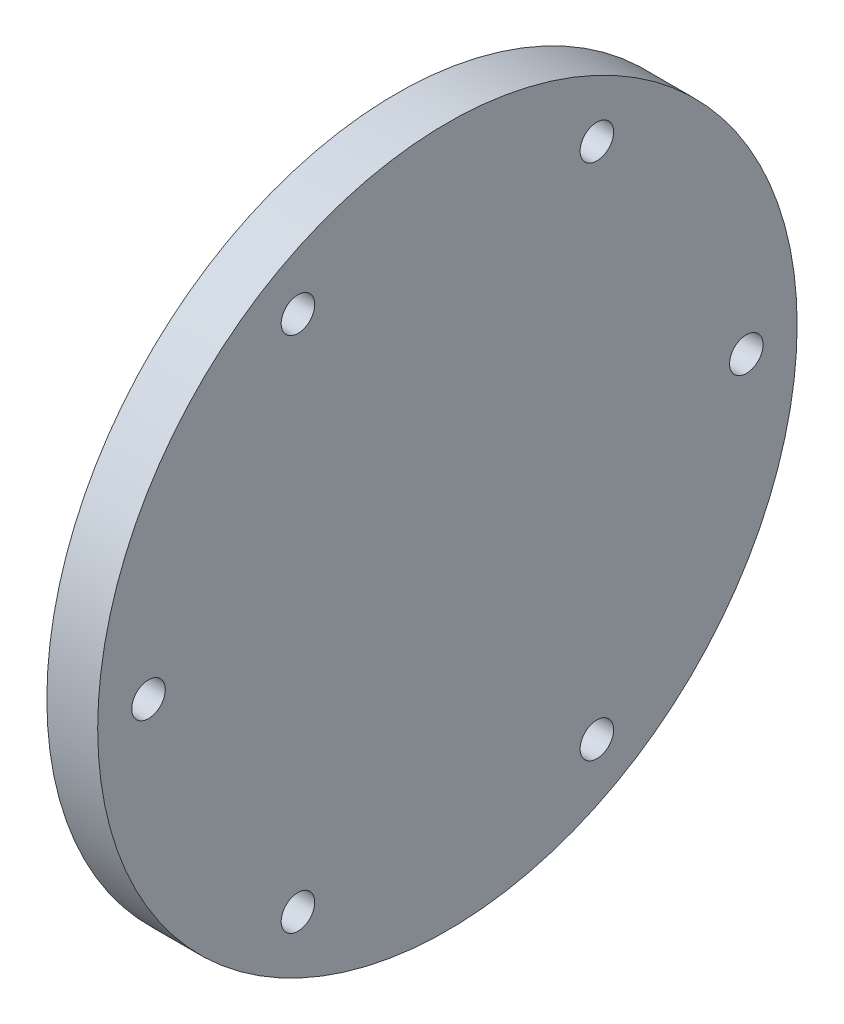
ISO-10303-21;
HEADER;
FILE_DESCRIPTION(('STEP AP214'),'2;1');
FILE_NAME('part.step','',(''),(''),'','','');
FILE_SCHEMA(('AUTOMOTIVE_DESIGN { 1 0 10303 214 1 1 1 1 }'));
ENDSEC;
DATA;
#1=APPLICATION_CONTEXT('core data for automotive mechanical design processes');
#2=APPLICATION_PROTOCOL_DEFINITION('international standard','automotive_design',2000,#1);
#3=PRODUCT_CONTEXT('',#1,'mechanical');
#4=PRODUCT('Part','Part','',(#3));
#5=PRODUCT_RELATED_PRODUCT_CATEGORY('part','',(#4));
#6=PRODUCT_DEFINITION_FORMATION('','',#4);
#7=PRODUCT_DEFINITION_CONTEXT('part definition',#1,'design');
#8=PRODUCT_DEFINITION('design','',#6,#7);
#9=PRODUCT_DEFINITION_SHAPE('','',#8);
#10=(LENGTH_UNIT() NAMED_UNIT(*) SI_UNIT(.MILLI.,.METRE.));
#11=(NAMED_UNIT(*) PLANE_ANGLE_UNIT() SI_UNIT($,.RADIAN.));
#12=(NAMED_UNIT(*) SI_UNIT($,.STERADIAN.) SOLID_ANGLE_UNIT());
#13=UNCERTAINTY_MEASURE_WITH_UNIT(LENGTH_MEASURE(1.E-05),#10,'distance_accuracy_value','');
#14=(GEOMETRIC_REPRESENTATION_CONTEXT(3) GLOBAL_UNCERTAINTY_ASSIGNED_CONTEXT((#13)) GLOBAL_UNIT_ASSIGNED_CONTEXT((#10,
#11,#12)) REPRESENTATION_CONTEXT('',''));
#15=CARTESIAN_POINT('',(0.,0.,0.));
#16=DIRECTION('',(0.,0.,1.));
#17=DIRECTION('',(1.,0.,0.));
#18=AXIS2_PLACEMENT_3D('',#15,#16,#17);
#19=CARTESIAN_POINT('',(163.7,34.4,0.));
#20=DIRECTION('',(1.,0.,0.));
#21=DIRECTION('',(0.,0.,-1.));
#22=AXIS2_PLACEMENT_3D('',#19,#20,#21);
#23=PLANE('',#22);
#24=CARTESIAN_POINT('',(163.7,0.,29.4));
#25=DIRECTION('',(1.,0.,0.));
#26=DIRECTION('',(0.,0.,-1.));
#27=AXIS2_PLACEMENT_3D('',#24,#25,#26);
#28=CIRCLE('',#27,1.65);
#29=CARTESIAN_POINT('',(163.7,0.,27.75));
#30=VERTEX_POINT('',#29);
#31=EDGE_CURVE('E49',#30,#30,#28,.F.);
#32=ORIENTED_EDGE('',*,*,#31,.F.);
#33=EDGE_LOOP('',(#32));
#34=FACE_BOUND('',#33,.T.);
#35=CARTESIAN_POINT('',(163.7,-25.4611468712625,14.7));
#36=DIRECTION('',(1.,0.,0.));
#37=DIRECTION('',(0.,0.,-1.));
#38=AXIS2_PLACEMENT_3D('',#35,#36,#37);
#39=CIRCLE('',#38,1.65);
#40=CARTESIAN_POINT('',(163.7,-25.4611468712625,13.05));
#41=VERTEX_POINT('',#40);
#42=EDGE_CURVE('E54',#41,#41,#39,.F.);
#43=ORIENTED_EDGE('',*,*,#42,.F.);
#44=EDGE_LOOP('',(#43));
#45=FACE_BOUND('',#44,.T.);
#46=CARTESIAN_POINT('',(163.7,-25.4611468712625,-14.7));
#47=DIRECTION('',(1.,0.,0.));
#48=DIRECTION('',(0.,0.,-1.));
#49=AXIS2_PLACEMENT_3D('',#46,#47,#48);
#50=CIRCLE('',#49,1.65);
#51=CARTESIAN_POINT('',(163.7,-25.4611468712625,-16.35));
#52=VERTEX_POINT('',#51);
#53=EDGE_CURVE('E60',#52,#52,#50,.F.);
#54=ORIENTED_EDGE('',*,*,#53,.F.);
#55=EDGE_LOOP('',(#54));
#56=FACE_BOUND('',#55,.T.);
#57=CARTESIAN_POINT('',(163.7,25.4611468712625,-14.7));
#58=DIRECTION('',(1.,0.,0.));
#59=DIRECTION('',(0.,0.,-1.));
#60=AXIS2_PLACEMENT_3D('',#57,#58,#59);
#61=CIRCLE('',#60,1.65);
#62=CARTESIAN_POINT('',(163.7,25.4611468712625,-16.35));
#63=VERTEX_POINT('',#62);
#64=EDGE_CURVE('E64',#63,#63,#61,.F.);
#65=ORIENTED_EDGE('',*,*,#64,.F.);
#66=EDGE_LOOP('',(#65));
#67=FACE_BOUND('',#66,.T.);
#68=CARTESIAN_POINT('',(163.7,0.,-29.4));
#69=DIRECTION('',(1.,0.,0.));
#70=DIRECTION('',(0.,0.,-1.));
#71=AXIS2_PLACEMENT_3D('',#68,#69,#70);
#72=CIRCLE('',#71,1.65);
#73=CARTESIAN_POINT('',(163.7,0.,-31.05));
#74=VERTEX_POINT('',#73);
#75=EDGE_CURVE('E68',#74,#74,#72,.F.);
#76=ORIENTED_EDGE('',*,*,#75,.F.);
#77=EDGE_LOOP('',(#76));
#78=FACE_BOUND('',#77,.T.);
#79=CARTESIAN_POINT('',(163.7,25.4611468712625,14.7));
#80=DIRECTION('',(1.,0.,0.));
#81=DIRECTION('',(0.,0.,-1.));
#82=AXIS2_PLACEMENT_3D('',#79,#80,#81);
#83=CIRCLE('',#82,1.65);
#84=CARTESIAN_POINT('',(163.7,25.4611468712625,13.05));
#85=VERTEX_POINT('',#84);
#86=EDGE_CURVE('E72',#85,#85,#83,.F.);
#87=ORIENTED_EDGE('',*,*,#86,.F.);
#88=EDGE_LOOP('',(#87));
#89=FACE_BOUND('',#88,.T.);
#90=CARTESIAN_POINT('',(163.7,0.,0.));
#91=DIRECTION('',(-1.,0.,0.));
#92=DIRECTION('',(0.,0.,1.));
#93=AXIS2_PLACEMENT_3D('',#90,#91,#92);
#94=CIRCLE('',#93,34.4);
#95=CARTESIAN_POINT('',(163.7,0.,34.4));
#96=VERTEX_POINT('',#95);
#97=EDGE_CURVE('E44',#96,#96,#94,.T.);
#98=ORIENTED_EDGE('',*,*,#97,.T.);
#99=EDGE_LOOP('',(#98));
#100=FACE_BOUND('',#99,.T.);
#101=ADVANCED_FACE('F37',(#34,#45,#56,#67,#78,#89,#100),#23,.F.);
#102=CARTESIAN_POINT('',(168.7,0.,0.));
#103=DIRECTION('',(-1.,0.,0.));
#104=DIRECTION('',(0.,0.,1.));
#105=AXIS2_PLACEMENT_3D('',#102,#103,#104);
#106=PLANE('',#105);
#107=CARTESIAN_POINT('',(168.7,0.,29.4));
#108=DIRECTION('',(1.,0.,0.));
#109=DIRECTION('',(0.,0.,-1.));
#110=AXIS2_PLACEMENT_3D('',#107,#108,#109);
#111=CIRCLE('',#110,1.65);
#112=CARTESIAN_POINT('',(168.7,0.,27.75));
#113=VERTEX_POINT('',#112);
#114=EDGE_CURVE('E76',#113,#113,#111,.T.);
#115=ORIENTED_EDGE('',*,*,#114,.F.);
#116=EDGE_LOOP('',(#115));
#117=FACE_BOUND('',#116,.T.);
#118=CARTESIAN_POINT('',(168.7,-25.4611468712625,14.7));
#119=DIRECTION('',(1.,0.,0.));
#120=DIRECTION('',(0.,0.,-1.));
#121=AXIS2_PLACEMENT_3D('',#118,#119,#120);
#122=CIRCLE('',#121,1.65);
#123=CARTESIAN_POINT('',(168.7,-25.4611468712625,13.05));
#124=VERTEX_POINT('',#123);
#125=EDGE_CURVE('E90',#124,#124,#122,.T.);
#126=ORIENTED_EDGE('',*,*,#125,.F.);
#127=EDGE_LOOP('',(#126));
#128=FACE_BOUND('',#127,.T.);
#129=CARTESIAN_POINT('',(168.7,-25.4611468712625,-14.7));
#130=DIRECTION('',(1.,0.,0.));
#131=DIRECTION('',(0.,0.,-1.));
#132=AXIS2_PLACEMENT_3D('',#129,#130,#131);
#133=CIRCLE('',#132,1.65);
#134=CARTESIAN_POINT('',(168.7,-25.4611468712625,-16.35));
#135=VERTEX_POINT('',#134);
#136=EDGE_CURVE('E81',#135,#135,#133,.T.);
#137=ORIENTED_EDGE('',*,*,#136,.F.);
#138=EDGE_LOOP('',(#137));
#139=FACE_BOUND('',#138,.T.);
#140=CARTESIAN_POINT('',(168.7,25.4611468712625,-14.7));
#141=DIRECTION('',(1.,0.,0.));
#142=DIRECTION('',(0.,0.,-1.));
#143=AXIS2_PLACEMENT_3D('',#140,#141,#142);
#144=CIRCLE('',#143,1.65);
#145=CARTESIAN_POINT('',(168.7,25.4611468712625,-16.35));
#146=VERTEX_POINT('',#145);
#147=EDGE_CURVE('E77',#146,#146,#144,.T.);
#148=ORIENTED_EDGE('',*,*,#147,.F.);
#149=EDGE_LOOP('',(#148));
#150=FACE_BOUND('',#149,.T.);
#151=CARTESIAN_POINT('',(168.7,0.,-29.4));
#152=DIRECTION('',(1.,0.,0.));
#153=DIRECTION('',(0.,0.,-1.));
#154=AXIS2_PLACEMENT_3D('',#151,#152,#153);
#155=CIRCLE('',#154,1.65);
#156=CARTESIAN_POINT('',(168.7,0.,-31.05));
#157=VERTEX_POINT('',#156);
#158=EDGE_CURVE('E82',#157,#157,#155,.T.);
#159=ORIENTED_EDGE('',*,*,#158,.F.);
#160=EDGE_LOOP('',(#159));
#161=FACE_BOUND('',#160,.T.);
#162=CARTESIAN_POINT('',(168.7,25.4611468712625,14.7));
#163=DIRECTION('',(1.,0.,0.));
#164=DIRECTION('',(0.,0.,-1.));
#165=AXIS2_PLACEMENT_3D('',#162,#163,#164);
#166=CIRCLE('',#165,1.65);
#167=CARTESIAN_POINT('',(168.7,25.4611468712625,13.05));
#168=VERTEX_POINT('',#167);
#169=EDGE_CURVE('E86',#168,#168,#166,.T.);
#170=ORIENTED_EDGE('',*,*,#169,.F.);
#171=EDGE_LOOP('',(#170));
#172=FACE_BOUND('',#171,.T.);
#173=CARTESIAN_POINT('',(168.7,0.,0.));
#174=DIRECTION('',(-1.,0.,0.));
#175=DIRECTION('',(0.,0.,1.));
#176=AXIS2_PLACEMENT_3D('',#173,#174,#175);
#177=CIRCLE('',#176,34.4);
#178=CARTESIAN_POINT('',(168.7,0.,34.4));
#179=VERTEX_POINT('',#178);
#180=EDGE_CURVE('E10',#179,#179,#177,.T.);
#181=ORIENTED_EDGE('',*,*,#180,.F.);
#182=EDGE_LOOP('',(#181));
#183=FACE_BOUND('',#182,.T.);
#184=ADVANCED_FACE('F104',(#117,#128,#139,#150,#161,#172,#183),#106,.F.);
#185=CARTESIAN_POINT('',(-110.,0.,0.));
#186=DIRECTION('',(-1.,0.,0.));
#187=DIRECTION('',(0.,0.,1.));
#188=AXIS2_PLACEMENT_3D('',#185,#186,#187);
#189=CYLINDRICAL_SURFACE('',#188,34.4);
#190=ORIENTED_EDGE('',*,*,#97,.F.);
#191=EDGE_LOOP('',(#190));
#192=FACE_BOUND('',#191,.T.);
#193=ORIENTED_EDGE('',*,*,#180,.T.);
#194=EDGE_LOOP('',(#193));
#195=FACE_BOUND('',#194,.T.);
#196=ADVANCED_FACE('F107',(#192,#195),#189,.T.);
#197=CARTESIAN_POINT('',(163.7,25.4611468712625,14.7));
#198=DIRECTION('',(-1.,0.,0.));
#199=DIRECTION('',(0.,0.,1.));
#200=AXIS2_PLACEMENT_3D('',#197,#198,#199);
#201=CYLINDRICAL_SURFACE('',#200,1.65);
#202=ORIENTED_EDGE('',*,*,#169,.T.);
#203=EDGE_LOOP('',(#202));
#204=FACE_BOUND('',#203,.T.);
#205=ORIENTED_EDGE('',*,*,#86,.T.);
#206=EDGE_LOOP('',(#205));
#207=FACE_BOUND('',#206,.T.);
#208=ADVANCED_FACE('F119',(#204,#207),#201,.F.);
#209=CARTESIAN_POINT('',(163.7,0.,-29.4));
#210=DIRECTION('',(-1.,0.,0.));
#211=DIRECTION('',(0.,0.,1.));
#212=AXIS2_PLACEMENT_3D('',#209,#210,#211);
#213=CYLINDRICAL_SURFACE('',#212,1.65);
#214=ORIENTED_EDGE('',*,*,#158,.T.);
#215=EDGE_LOOP('',(#214));
#216=FACE_BOUND('',#215,.T.);
#217=ORIENTED_EDGE('',*,*,#75,.T.);
#218=EDGE_LOOP('',(#217));
#219=FACE_BOUND('',#218,.T.);
#220=ADVANCED_FACE('F122',(#216,#219),#213,.F.);
#221=CARTESIAN_POINT('',(163.7,25.4611468712625,-14.7));
#222=DIRECTION('',(-1.,0.,0.));
#223=DIRECTION('',(0.,0.,1.));
#224=AXIS2_PLACEMENT_3D('',#221,#222,#223);
#225=CYLINDRICAL_SURFACE('',#224,1.65);
#226=ORIENTED_EDGE('',*,*,#147,.T.);
#227=EDGE_LOOP('',(#226));
#228=FACE_BOUND('',#227,.T.);
#229=ORIENTED_EDGE('',*,*,#64,.T.);
#230=EDGE_LOOP('',(#229));
#231=FACE_BOUND('',#230,.T.);
#232=ADVANCED_FACE('F141',(#228,#231),#225,.F.);
#233=CARTESIAN_POINT('',(163.7,-25.4611468712625,-14.7));
#234=DIRECTION('',(-1.,0.,0.));
#235=DIRECTION('',(0.,0.,1.));
#236=AXIS2_PLACEMENT_3D('',#233,#234,#235);
#237=CYLINDRICAL_SURFACE('',#236,1.65);
#238=ORIENTED_EDGE('',*,*,#136,.T.);
#239=EDGE_LOOP('',(#238));
#240=FACE_BOUND('',#239,.T.);
#241=ORIENTED_EDGE('',*,*,#53,.T.);
#242=EDGE_LOOP('',(#241));
#243=FACE_BOUND('',#242,.T.);
#244=ADVANCED_FACE('F147',(#240,#243),#237,.F.);
#245=CARTESIAN_POINT('',(163.7,-25.4611468712625,14.7));
#246=DIRECTION('',(-1.,0.,0.));
#247=DIRECTION('',(0.,0.,1.));
#248=AXIS2_PLACEMENT_3D('',#245,#246,#247);
#249=CYLINDRICAL_SURFACE('',#248,1.65);
#250=ORIENTED_EDGE('',*,*,#125,.T.);
#251=EDGE_LOOP('',(#250));
#252=FACE_BOUND('',#251,.T.);
#253=ORIENTED_EDGE('',*,*,#42,.T.);
#254=EDGE_LOOP('',(#253));
#255=FACE_BOUND('',#254,.T.);
#256=ADVANCED_FACE('F151',(#252,#255),#249,.F.);
#257=CARTESIAN_POINT('',(163.7,0.,29.4));
#258=DIRECTION('',(-1.,0.,0.));
#259=DIRECTION('',(0.,0.,1.));
#260=AXIS2_PLACEMENT_3D('',#257,#258,#259);
#261=CYLINDRICAL_SURFACE('',#260,1.65);
#262=ORIENTED_EDGE('',*,*,#114,.T.);
#263=EDGE_LOOP('',(#262));
#264=FACE_BOUND('',#263,.T.);
#265=ORIENTED_EDGE('',*,*,#31,.T.);
#266=EDGE_LOOP('',(#265));
#267=FACE_BOUND('',#266,.T.);
#268=ADVANCED_FACE('F101',(#264,#267),#261,.F.);
#269=CLOSED_SHELL('',(#101,#184,#196,#208,#220,#232,#244,#256,#268));
#270=MANIFOLD_SOLID_BREP('B2',#269);
#271=ADVANCED_BREP_SHAPE_REPRESENTATION('',(#18,#270),#14);
#272=SHAPE_DEFINITION_REPRESENTATION(#9,#271);
ENDSEC;
END-ISO-10303-21;
